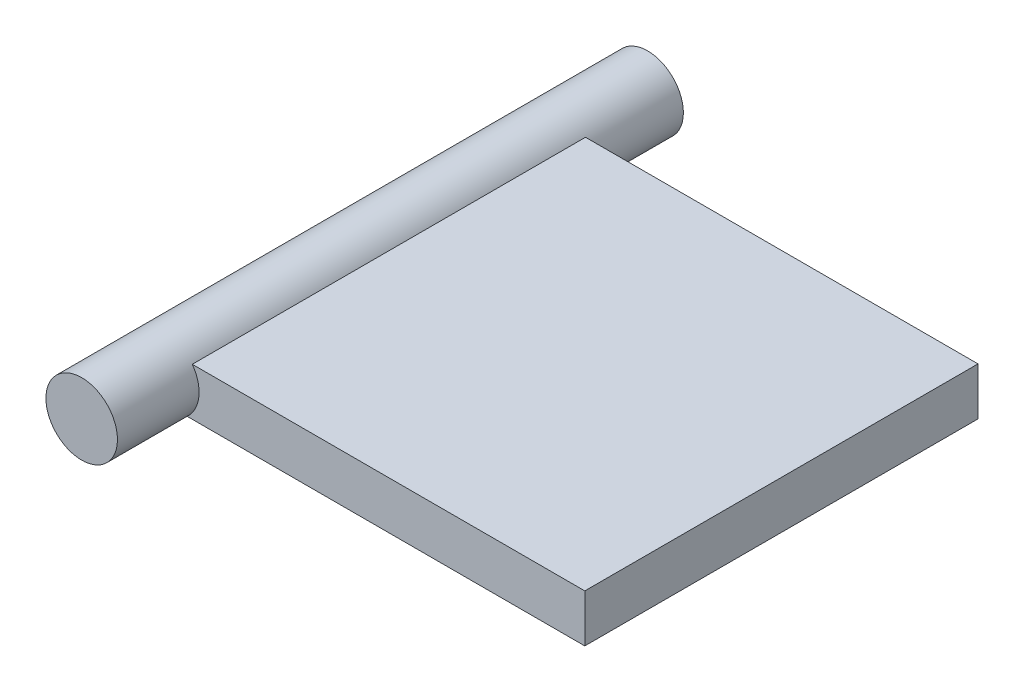
ISO-10303-21;
HEADER;
FILE_DESCRIPTION(('STEP AP214'),'2;1');
FILE_NAME('part.step','',(''),(''),'','','');
FILE_SCHEMA(('AUTOMOTIVE_DESIGN { 1 0 10303 214 1 1 1 1 }'));
ENDSEC;
DATA;
#1=APPLICATION_CONTEXT('core data for automotive mechanical design processes');
#2=APPLICATION_PROTOCOL_DEFINITION('international standard','automotive_design',2000,#1);
#3=PRODUCT_CONTEXT('',#1,'mechanical');
#4=PRODUCT('Part','Part','',(#3));
#5=PRODUCT_RELATED_PRODUCT_CATEGORY('part','',(#4));
#6=PRODUCT_DEFINITION_FORMATION('','',#4);
#7=PRODUCT_DEFINITION_CONTEXT('part definition',#1,'design');
#8=PRODUCT_DEFINITION('design','',#6,#7);
#9=PRODUCT_DEFINITION_SHAPE('','',#8);
#10=(LENGTH_UNIT() NAMED_UNIT(*) SI_UNIT(.MILLI.,.METRE.));
#11=(NAMED_UNIT(*) PLANE_ANGLE_UNIT() SI_UNIT($,.RADIAN.));
#12=(NAMED_UNIT(*) SI_UNIT($,.STERADIAN.) SOLID_ANGLE_UNIT());
#13=UNCERTAINTY_MEASURE_WITH_UNIT(LENGTH_MEASURE(1.E-05),#10,'distance_accuracy_value','');
#14=(GEOMETRIC_REPRESENTATION_CONTEXT(3) GLOBAL_UNCERTAINTY_ASSIGNED_CONTEXT((#13)) GLOBAL_UNIT_ASSIGNED_CONTEXT((#10,
#11,#12)) REPRESENTATION_CONTEXT('',''));
#15=CARTESIAN_POINT('',(0.,0.,0.));
#16=DIRECTION('',(0.,0.,1.));
#17=DIRECTION('',(1.,0.,0.));
#18=AXIS2_PLACEMENT_3D('',#15,#16,#17);
#19=CARTESIAN_POINT('',(0.,0.,1187.));
#20=DIRECTION('',(0.,0.,-1.));
#21=DIRECTION('',(-1.,0.,0.));
#22=AXIS2_PLACEMENT_3D('',#19,#20,#21);
#23=CYLINDRICAL_SURFACE('',#22,75.);
#24=CARTESIAN_POINT('',(0.,0.,0.));
#25=DIRECTION('',(0.,0.,1.));
#26=DIRECTION('',(1.,0.,0.));
#27=AXIS2_PLACEMENT_3D('',#24,#25,#26);
#28=CIRCLE('',#27,75.);
#29=CARTESIAN_POINT('',(75.,0.,0.));
#30=VERTEX_POINT('',#29);
#31=EDGE_CURVE('E104',#30,#30,#28,.T.);
#32=ORIENTED_EDGE('',*,*,#31,.T.);
#33=EDGE_LOOP('',(#32));
#34=FACE_BOUND('',#33,.T.);
#35=CARTESIAN_POINT('',(0.,0.,1187.));
#36=DIRECTION('',(0.,0.,1.));
#37=DIRECTION('',(1.,0.,0.));
#38=AXIS2_PLACEMENT_3D('',#35,#36,#37);
#39=CIRCLE('',#38,75.);
#40=CARTESIAN_POINT('',(75.,0.,1187.));
#41=VERTEX_POINT('',#40);
#42=EDGE_CURVE('E109',#41,#41,#39,.T.);
#43=ORIENTED_EDGE('',*,*,#42,.F.);
#44=EDGE_LOOP('',(#43));
#45=FACE_BOUND('',#44,.T.);
#46=CARTESIAN_POINT('',(0.,0.,1015.77782468486));
#47=DIRECTION('',(0.,0.,-1.));
#48=DIRECTION('',(-1.,0.,0.));
#49=AXIS2_PLACEMENT_3D('',#46,#47,#48);
#50=CIRCLE('',#49,75.);
#51=CARTESIAN_POINT('',(60.7673011809188,43.9583337626387,1015.77782468486));
#52=VERTEX_POINT('',#51);
#53=CARTESIAN_POINT('',(49.8430701837295,-56.0416662373614,1015.77782468486));
#54=VERTEX_POINT('',#53);
#55=EDGE_CURVE('E11',#52,#54,#50,.T.);
#56=ORIENTED_EDGE('',*,*,#55,.F.);
#57=DIRECTION('',(0.,0.,-1.));
#58=VECTOR('',#57,1.);
#59=CARTESIAN_POINT('',(60.7673011809185,43.9583337626387,1187.));
#60=LINE('',#59,#58);
#61=CARTESIAN_POINT('',(60.7673011809185,43.9583337626387,191.065962461293));
#62=VERTEX_POINT('',#61);
#63=EDGE_CURVE('E117',#62,#52,#60,.F.);
#64=ORIENTED_EDGE('',*,*,#63,.F.);
#65=CARTESIAN_POINT('',(0.,0.,191.065962461293));
#66=DIRECTION('',(0.,0.,1.));
#67=DIRECTION('',(1.,0.,0.));
#68=AXIS2_PLACEMENT_3D('',#65,#66,#67);
#69=CIRCLE('',#68,75.);
#70=CARTESIAN_POINT('',(49.8430701837296,-56.0416662373613,191.065962461293));
#71=VERTEX_POINT('',#70);
#72=EDGE_CURVE('E61',#71,#62,#69,.T.);
#73=ORIENTED_EDGE('',*,*,#72,.F.);
#74=DIRECTION('',(0.,0.,-1.));
#75=VECTOR('',#74,1.);
#76=CARTESIAN_POINT('',(49.8430701837295,-56.0416662373614,1187.));
#77=LINE('',#76,#75);
#78=EDGE_CURVE('E51',#54,#71,#77,.T.);
#79=ORIENTED_EDGE('',*,*,#78,.F.);
#80=EDGE_LOOP('',(#56,#64,#73,#79));
#81=FACE_BOUND('',#80,.T.);
#82=ADVANCED_FACE('F43',(#34,#45,#81),#23,.T.);
#83=CARTESIAN_POINT('',(0.,0.,1187.));
#84=DIRECTION('',(0.,0.,1.));
#85=DIRECTION('',(1.,0.,0.));
#86=AXIS2_PLACEMENT_3D('',#83,#84,#85);
#87=PLANE('',#86);
#88=ORIENTED_EDGE('',*,*,#42,.T.);
#89=EDGE_LOOP('',(#88));
#90=FACE_BOUND('',#89,.T.);
#91=ADVANCED_FACE('F139',(#90),#87,.T.);
#92=CARTESIAN_POINT('',(0.,0.,0.));
#93=DIRECTION('',(0.,0.,1.));
#94=DIRECTION('',(1.,0.,0.));
#95=AXIS2_PLACEMENT_3D('',#92,#93,#94);
#96=PLANE('',#95);
#97=ORIENTED_EDGE('',*,*,#31,.F.);
#98=EDGE_LOOP('',(#97));
#99=FACE_BOUND('',#98,.T.);
#100=ADVANCED_FACE('F144',(#99),#96,.F.);
#101=CARTESIAN_POINT('',(884.000000000001,-56.0416662373614,1015.77782468486));
#102=DIRECTION('',(0.,1.,0.));
#103=DIRECTION('',(0.,0.,1.));
#104=AXIS2_PLACEMENT_3D('',#101,#102,#103);
#105=PLANE('',#104);
#106=DIRECTION('',(-1.,0.,0.));
#107=VECTOR('',#106,1.);
#108=CARTESIAN_POINT('',(884.000000000001,-56.0416662373614,1015.77782468486));
#109=LINE('',#108,#107);
#110=CARTESIAN_POINT('',(884.000000000001,-56.0416662373614,1015.77782468486));
#111=VERTEX_POINT('',#110);
#112=EDGE_CURVE('E84',#111,#54,#109,.T.);
#113=ORIENTED_EDGE('',*,*,#112,.T.);
#114=ORIENTED_EDGE('',*,*,#78,.T.);
#115=DIRECTION('',(-1.,0.,0.));
#116=VECTOR('',#115,1.);
#117=CARTESIAN_POINT('',(884.000000000001,-56.0416662373614,191.065962461293));
#118=LINE('',#117,#116);
#119=CARTESIAN_POINT('',(884.000000000001,-56.0416662373614,191.065962461293));
#120=VERTEX_POINT('',#119);
#121=EDGE_CURVE('E86',#120,#71,#118,.T.);
#122=ORIENTED_EDGE('',*,*,#121,.F.);
#123=DIRECTION('',(0.,0.,-1.));
#124=VECTOR('',#123,1.);
#125=CARTESIAN_POINT('',(884.000000000001,-56.0416662373614,1015.77782468486));
#126=LINE('',#125,#124);
#127=EDGE_CURVE('E80',#111,#120,#126,.T.);
#128=ORIENTED_EDGE('',*,*,#127,.F.);
#129=EDGE_LOOP('',(#113,#114,#122,#128));
#130=FACE_BOUND('',#129,.T.);
#131=ADVANCED_FACE('F82',(#130),#105,.F.);
#132=CARTESIAN_POINT('',(884.000000000001,43.9583337626387,1015.77782468486));
#133=DIRECTION('',(0.,-1.,0.));
#134=DIRECTION('',(0.,0.,-1.));
#135=AXIS2_PLACEMENT_3D('',#132,#133,#134);
#136=PLANE('',#135);
#137=DIRECTION('',(-1.,0.,0.));
#138=VECTOR('',#137,1.);
#139=CARTESIAN_POINT('',(884.000000000001,43.9583337626387,191.065962461293));
#140=LINE('',#139,#138);
#141=CARTESIAN_POINT('',(884.000000000001,43.9583337626387,191.065962461293));
#142=VERTEX_POINT('',#141);
#143=EDGE_CURVE('E111',#142,#62,#140,.T.);
#144=ORIENTED_EDGE('',*,*,#143,.T.);
#145=ORIENTED_EDGE('',*,*,#63,.T.);
#146=DIRECTION('',(-1.,0.,0.));
#147=VECTOR('',#146,1.);
#148=CARTESIAN_POINT('',(884.000000000001,43.9583337626387,1015.77782468486));
#149=LINE('',#148,#147);
#150=CARTESIAN_POINT('',(884.000000000001,43.9583337626387,1015.77782468486));
#151=VERTEX_POINT('',#150);
#152=EDGE_CURVE('E131',#151,#52,#149,.T.);
#153=ORIENTED_EDGE('',*,*,#152,.F.);
#154=DIRECTION('',(0.,0.,1.));
#155=VECTOR('',#154,1.);
#156=CARTESIAN_POINT('',(884.000000000001,43.9583337626387,1015.77782468486));
#157=LINE('',#156,#155);
#158=EDGE_CURVE('E96',#142,#151,#157,.T.);
#159=ORIENTED_EDGE('',*,*,#158,.F.);
#160=EDGE_LOOP('',(#144,#145,#153,#159));
#161=FACE_BOUND('',#160,.T.);
#162=ADVANCED_FACE('F137',(#161),#136,.F.);
#163=CARTESIAN_POINT('',(884.000000000001,43.9583337626387,1015.77782468486));
#164=DIRECTION('',(0.,0.,-1.));
#165=DIRECTION('',(-1.,0.,0.));
#166=AXIS2_PLACEMENT_3D('',#163,#164,#165);
#167=PLANE('',#166);
#168=ORIENTED_EDGE('',*,*,#152,.T.);
#169=ORIENTED_EDGE('',*,*,#55,.T.);
#170=ORIENTED_EDGE('',*,*,#112,.F.);
#171=DIRECTION('',(0.,-1.,0.));
#172=VECTOR('',#171,1.);
#173=CARTESIAN_POINT('',(884.000000000001,43.9583337626387,1015.77782468486));
#174=LINE('',#173,#172);
#175=EDGE_CURVE('E91',#151,#111,#174,.T.);
#176=ORIENTED_EDGE('',*,*,#175,.F.);
#177=EDGE_LOOP('',(#168,#169,#170,#176));
#178=FACE_BOUND('',#177,.T.);
#179=ADVANCED_FACE('F102',(#178),#167,.F.);
#180=CARTESIAN_POINT('',(884.000000000001,43.9583337626387,191.065962461293));
#181=DIRECTION('',(0.,0.,1.));
#182=DIRECTION('',(1.,0.,0.));
#183=AXIS2_PLACEMENT_3D('',#180,#181,#182);
#184=PLANE('',#183);
#185=ORIENTED_EDGE('',*,*,#121,.T.);
#186=ORIENTED_EDGE('',*,*,#72,.T.);
#187=ORIENTED_EDGE('',*,*,#143,.F.);
#188=DIRECTION('',(0.,1.,0.));
#189=VECTOR('',#188,1.);
#190=CARTESIAN_POINT('',(884.000000000001,43.9583337626387,191.065962461293));
#191=LINE('',#190,#189);
#192=EDGE_CURVE('E90',#120,#142,#191,.T.);
#193=ORIENTED_EDGE('',*,*,#192,.F.);
#194=EDGE_LOOP('',(#185,#186,#187,#193));
#195=FACE_BOUND('',#194,.T.);
#196=ADVANCED_FACE('F125',(#195),#184,.F.);
#197=CARTESIAN_POINT('',(884.000000000001,0.,0.));
#198=DIRECTION('',(1.,0.,0.));
#199=DIRECTION('',(0.,0.,-1.));
#200=AXIS2_PLACEMENT_3D('',#197,#198,#199);
#201=PLANE('',#200);
#202=ORIENTED_EDGE('',*,*,#175,.T.);
#203=ORIENTED_EDGE('',*,*,#127,.T.);
#204=ORIENTED_EDGE('',*,*,#192,.T.);
#205=ORIENTED_EDGE('',*,*,#158,.T.);
#206=EDGE_LOOP('',(#202,#203,#204,#205));
#207=FACE_BOUND('',#206,.T.);
#208=ADVANCED_FACE('F94',(#207),#201,.T.);
#209=CLOSED_SHELL('',(#82,#91,#100,#131,#162,#179,#196,#208));
#210=MANIFOLD_SOLID_BREP('B2',#209);
#211=ADVANCED_BREP_SHAPE_REPRESENTATION('',(#18,#210),#14);
#212=SHAPE_DEFINITION_REPRESENTATION(#9,#211);
ENDSEC;
END-ISO-10303-21;
